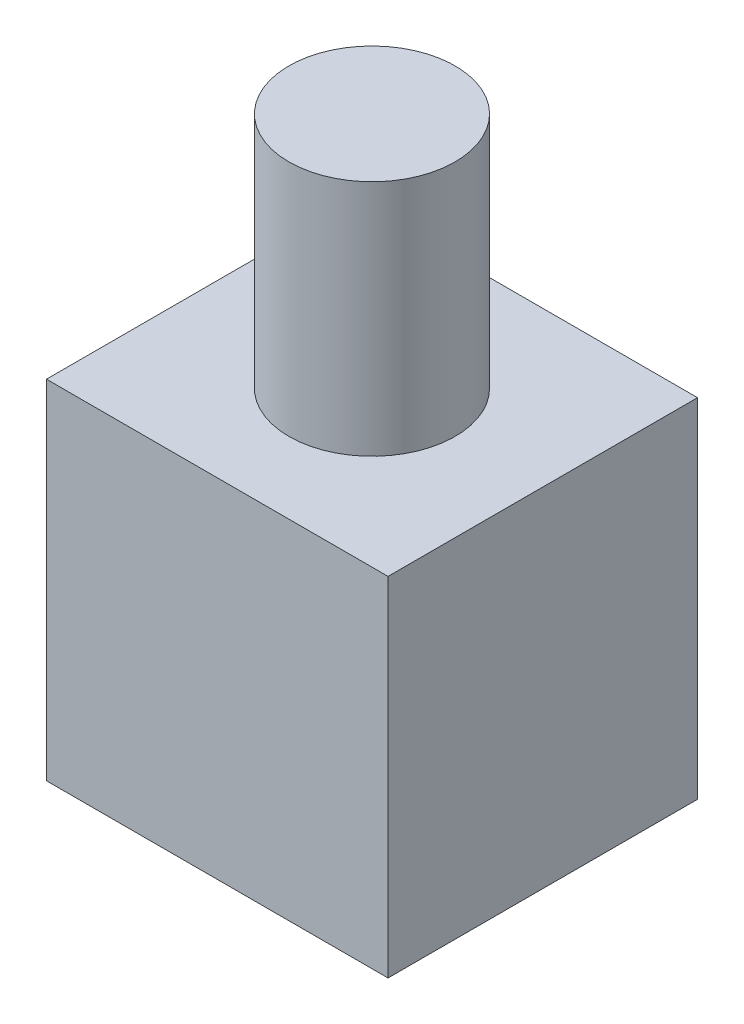
ISO-10303-21;
HEADER;
FILE_DESCRIPTION(('STEP AP214'),'2;1');
FILE_NAME('part.step','',(''),(''),'','','');
FILE_SCHEMA(('AUTOMOTIVE_DESIGN { 1 0 10303 214 1 1 1 1 }'));
ENDSEC;
DATA;
#1=APPLICATION_CONTEXT('core data for automotive mechanical design processes');
#2=APPLICATION_PROTOCOL_DEFINITION('international standard','automotive_design',2000,#1);
#3=PRODUCT_CONTEXT('',#1,'mechanical');
#4=PRODUCT('Part','Part','',(#3));
#5=PRODUCT_RELATED_PRODUCT_CATEGORY('part','',(#4));
#6=PRODUCT_DEFINITION_FORMATION('','',#4);
#7=PRODUCT_DEFINITION_CONTEXT('part definition',#1,'design');
#8=PRODUCT_DEFINITION('design','',#6,#7);
#9=PRODUCT_DEFINITION_SHAPE('','',#8);
#10=(LENGTH_UNIT() NAMED_UNIT(*) SI_UNIT(.MILLI.,.METRE.));
#11=(NAMED_UNIT(*) PLANE_ANGLE_UNIT() SI_UNIT($,.RADIAN.));
#12=(NAMED_UNIT(*) SI_UNIT($,.STERADIAN.) SOLID_ANGLE_UNIT());
#13=UNCERTAINTY_MEASURE_WITH_UNIT(LENGTH_MEASURE(1.E-05),#10,'distance_accuracy_value','');
#14=(GEOMETRIC_REPRESENTATION_CONTEXT(3) GLOBAL_UNCERTAINTY_ASSIGNED_CONTEXT((#13)) GLOBAL_UNIT_ASSIGNED_CONTEXT((#10,
#11,#12)) REPRESENTATION_CONTEXT('',''));
#15=CARTESIAN_POINT('',(0.,0.,0.));
#16=DIRECTION('',(0.,0.,1.));
#17=DIRECTION('',(1.,0.,0.));
#18=AXIS2_PLACEMENT_3D('',#15,#16,#17);
#19=CARTESIAN_POINT('',(0.,12.8,-11.39));
#20=DIRECTION('',(1.,0.,0.));
#21=DIRECTION('',(0.,0.,-1.));
#22=AXIS2_PLACEMENT_3D('',#19,#20,#21);
#23=PLANE('',#22);
#24=DIRECTION('',(0.,0.,1.));
#25=VECTOR('',#24,1.);
#26=CARTESIAN_POINT('',(0.,0.,-11.39));
#27=LINE('',#26,#25);
#28=CARTESIAN_POINT('',(0.,0.,-11.39));
#29=VERTEX_POINT('',#28);
#30=CARTESIAN_POINT('',(0.,0.,0.));
#31=VERTEX_POINT('',#30);
#32=EDGE_CURVE('E96',#29,#31,#27,.T.);
#33=ORIENTED_EDGE('',*,*,#32,.T.);
#34=DIRECTION('',(0.,-1.,0.));
#35=VECTOR('',#34,1.);
#36=CARTESIAN_POINT('',(0.,12.8,0.));
#37=LINE('',#36,#35);
#38=CARTESIAN_POINT('',(0.,12.8,0.));
#39=VERTEX_POINT('',#38);
#40=EDGE_CURVE('E11',#39,#31,#37,.T.);
#41=ORIENTED_EDGE('',*,*,#40,.F.);
#42=DIRECTION('',(0.,0.,1.));
#43=VECTOR('',#42,1.);
#44=CARTESIAN_POINT('',(0.,12.8,-11.39));
#45=LINE('',#44,#43);
#46=CARTESIAN_POINT('',(0.,12.8,-11.39));
#47=VERTEX_POINT('',#46);
#48=EDGE_CURVE('E84',#47,#39,#45,.T.);
#49=ORIENTED_EDGE('',*,*,#48,.F.);
#50=DIRECTION('',(0.,-1.,0.));
#51=VECTOR('',#50,1.);
#52=CARTESIAN_POINT('',(0.,12.8,-11.39));
#53=LINE('',#52,#51);
#54=EDGE_CURVE('E92',#47,#29,#53,.T.);
#55=ORIENTED_EDGE('',*,*,#54,.T.);
#56=EDGE_LOOP('',(#33,#41,#49,#55));
#57=FACE_BOUND('',#56,.T.);
#58=ADVANCED_FACE('F33',(#57),#23,.F.);
#59=CARTESIAN_POINT('',(0.,12.8,0.));
#60=DIRECTION('',(0.,0.,-1.));
#61=DIRECTION('',(-1.,0.,0.));
#62=AXIS2_PLACEMENT_3D('',#59,#60,#61);
#63=PLANE('',#62);
#64=DIRECTION('',(1.,0.,0.));
#65=VECTOR('',#64,1.);
#66=CARTESIAN_POINT('',(0.,0.,0.));
#67=LINE('',#66,#65);
#68=CARTESIAN_POINT('',(12.57,0.,0.));
#69=VERTEX_POINT('',#68);
#70=EDGE_CURVE('E88',#31,#69,#67,.T.);
#71=ORIENTED_EDGE('',*,*,#70,.T.);
#72=DIRECTION('',(0.,-1.,0.));
#73=VECTOR('',#72,1.);
#74=CARTESIAN_POINT('',(12.57,12.8,0.));
#75=LINE('',#74,#73);
#76=CARTESIAN_POINT('',(12.57,12.8,0.));
#77=VERTEX_POINT('',#76);
#78=EDGE_CURVE('E41',#77,#69,#75,.T.);
#79=ORIENTED_EDGE('',*,*,#78,.F.);
#80=DIRECTION('',(1.,0.,0.));
#81=VECTOR('',#80,1.);
#82=CARTESIAN_POINT('',(0.,12.8,0.));
#83=LINE('',#82,#81);
#84=EDGE_CURVE('E79',#39,#77,#83,.T.);
#85=ORIENTED_EDGE('',*,*,#84,.F.);
#86=ORIENTED_EDGE('',*,*,#40,.T.);
#87=EDGE_LOOP('',(#71,#79,#85,#86));
#88=FACE_BOUND('',#87,.T.);
#89=ADVANCED_FACE('F87',(#88),#63,.F.);
#90=CARTESIAN_POINT('',(12.57,12.8,0.));
#91=DIRECTION('',(-1.,0.,0.));
#92=DIRECTION('',(0.,0.,1.));
#93=AXIS2_PLACEMENT_3D('',#90,#91,#92);
#94=PLANE('',#93);
#95=DIRECTION('',(0.,0.,-1.));
#96=VECTOR('',#95,1.);
#97=CARTESIAN_POINT('',(12.57,0.,0.));
#98=LINE('',#97,#96);
#99=CARTESIAN_POINT('',(12.57,0.,-11.39));
#100=VERTEX_POINT('',#99);
#101=EDGE_CURVE('E66',#69,#100,#98,.T.);
#102=ORIENTED_EDGE('',*,*,#101,.T.);
#103=DIRECTION('',(0.,-1.,0.));
#104=VECTOR('',#103,1.);
#105=CARTESIAN_POINT('',(12.57,12.8,-11.39));
#106=LINE('',#105,#104);
#107=CARTESIAN_POINT('',(12.57,12.8,-11.39));
#108=VERTEX_POINT('',#107);
#109=EDGE_CURVE('E89',#108,#100,#106,.T.);
#110=ORIENTED_EDGE('',*,*,#109,.F.);
#111=DIRECTION('',(0.,0.,-1.));
#112=VECTOR('',#111,1.);
#113=CARTESIAN_POINT('',(12.57,12.8,0.));
#114=LINE('',#113,#112);
#115=EDGE_CURVE('E82',#77,#108,#114,.T.);
#116=ORIENTED_EDGE('',*,*,#115,.F.);
#117=ORIENTED_EDGE('',*,*,#78,.T.);
#118=EDGE_LOOP('',(#102,#110,#116,#117));
#119=FACE_BOUND('',#118,.T.);
#120=ADVANCED_FACE('F90',(#119),#94,.F.);
#121=CARTESIAN_POINT('',(12.57,12.8,-11.39));
#122=DIRECTION('',(0.,0.,1.));
#123=DIRECTION('',(1.,0.,0.));
#124=AXIS2_PLACEMENT_3D('',#121,#122,#123);
#125=PLANE('',#124);
#126=DIRECTION('',(-1.,0.,0.));
#127=VECTOR('',#126,1.);
#128=CARTESIAN_POINT('',(12.57,0.,-11.39));
#129=LINE('',#128,#127);
#130=EDGE_CURVE('E72',#100,#29,#129,.T.);
#131=ORIENTED_EDGE('',*,*,#130,.T.);
#132=ORIENTED_EDGE('',*,*,#54,.F.);
#133=DIRECTION('',(-1.,0.,0.));
#134=VECTOR('',#133,1.);
#135=CARTESIAN_POINT('',(12.57,12.8,-11.39));
#136=LINE('',#135,#134);
#137=EDGE_CURVE('E49',#108,#47,#136,.T.);
#138=ORIENTED_EDGE('',*,*,#137,.F.);
#139=ORIENTED_EDGE('',*,*,#109,.T.);
#140=EDGE_LOOP('',(#131,#132,#138,#139));
#141=FACE_BOUND('',#140,.T.);
#142=ADVANCED_FACE('F104',(#141),#125,.F.);
#143=CARTESIAN_POINT('',(0.,12.8,0.));
#144=DIRECTION('',(0.,1.,0.));
#145=DIRECTION('',(0.,0.,1.));
#146=AXIS2_PLACEMENT_3D('',#143,#144,#145);
#147=PLANE('',#146);
#148=CARTESIAN_POINT('',(6.285,12.8,-5.695));
#149=DIRECTION('',(0.,1.,0.));
#150=DIRECTION('',(0.,0.,1.));
#151=AXIS2_PLACEMENT_3D('',#148,#149,#150);
#152=CIRCLE('',#151,3.06);
#153=CARTESIAN_POINT('',(6.285,12.8,-2.635));
#154=VERTEX_POINT('',#153);
#155=EDGE_CURVE('E110',#154,#154,#152,.T.);
#156=ORIENTED_EDGE('',*,*,#155,.F.);
#157=EDGE_LOOP('',(#156));
#158=FACE_BOUND('',#157,.T.);
#159=ORIENTED_EDGE('',*,*,#48,.T.);
#160=ORIENTED_EDGE('',*,*,#84,.T.);
#161=ORIENTED_EDGE('',*,*,#115,.T.);
#162=ORIENTED_EDGE('',*,*,#137,.T.);
#163=EDGE_LOOP('',(#159,#160,#161,#162));
#164=FACE_BOUND('',#163,.T.);
#165=ADVANCED_FACE('F80',(#158,#164),#147,.T.);
#166=CARTESIAN_POINT('',(0.,0.,0.));
#167=DIRECTION('',(0.,1.,0.));
#168=DIRECTION('',(0.,0.,1.));
#169=AXIS2_PLACEMENT_3D('',#166,#167,#168);
#170=PLANE('',#169);
#171=ORIENTED_EDGE('',*,*,#32,.F.);
#172=ORIENTED_EDGE('',*,*,#130,.F.);
#173=ORIENTED_EDGE('',*,*,#101,.F.);
#174=ORIENTED_EDGE('',*,*,#70,.F.);
#175=EDGE_LOOP('',(#171,#172,#173,#174));
#176=FACE_BOUND('',#175,.T.);
#177=ADVANCED_FACE('F107',(#176),#170,.F.);
#178=CARTESIAN_POINT('',(6.285,21.55,-5.695));
#179=DIRECTION('',(0.,-1.,0.));
#180=DIRECTION('',(0.,0.,-1.));
#181=AXIS2_PLACEMENT_3D('',#178,#179,#180);
#182=CYLINDRICAL_SURFACE('',#181,3.06);
#183=CARTESIAN_POINT('',(6.285,21.55,-5.695));
#184=DIRECTION('',(0.,1.,0.));
#185=DIRECTION('',(0.,0.,1.));
#186=AXIS2_PLACEMENT_3D('',#183,#184,#185);
#187=CIRCLE('',#186,3.06);
#188=CARTESIAN_POINT('',(6.285,21.55,-2.635));
#189=VERTEX_POINT('',#188);
#190=EDGE_CURVE('E99',#189,#189,#187,.T.);
#191=ORIENTED_EDGE('',*,*,#190,.F.);
#192=EDGE_LOOP('',(#191));
#193=FACE_BOUND('',#192,.T.);
#194=ORIENTED_EDGE('',*,*,#155,.T.);
#195=EDGE_LOOP('',(#194));
#196=FACE_BOUND('',#195,.T.);
#197=ADVANCED_FACE('F118',(#193,#196),#182,.T.);
#198=CARTESIAN_POINT('',(6.285,21.55,-5.695));
#199=DIRECTION('',(0.,1.,0.));
#200=DIRECTION('',(0.,0.,1.));
#201=AXIS2_PLACEMENT_3D('',#198,#199,#200);
#202=PLANE('',#201);
#203=ORIENTED_EDGE('',*,*,#190,.T.);
#204=EDGE_LOOP('',(#203));
#205=FACE_BOUND('',#204,.T.);
#206=ADVANCED_FACE('F116',(#205),#202,.T.);
#207=CLOSED_SHELL('',(#58,#89,#120,#142,#165,#177,#197,#206));
#208=MANIFOLD_SOLID_BREP('B2',#207);
#209=ADVANCED_BREP_SHAPE_REPRESENTATION('',(#18,#208),#14);
#210=SHAPE_DEFINITION_REPRESENTATION(#9,#209);
ENDSEC;
END-ISO-10303-21;
